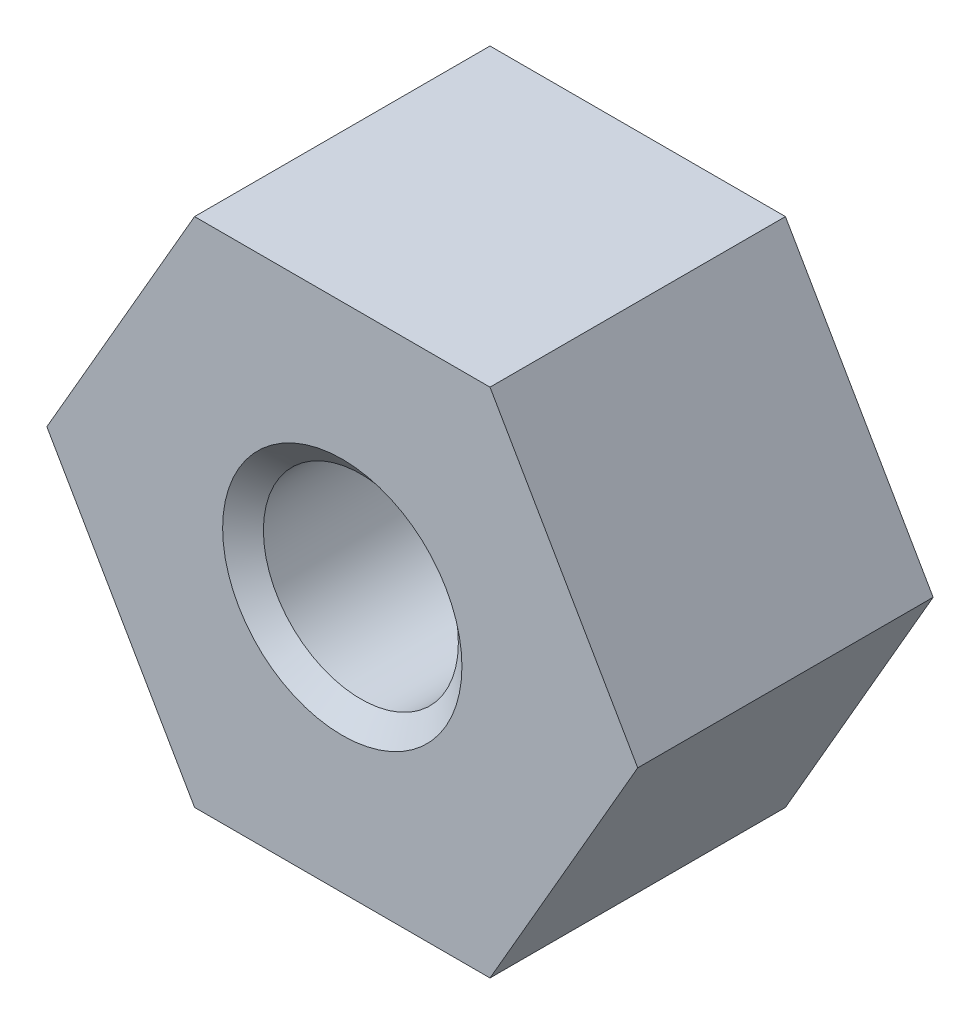
ISO-10303-21;
HEADER;
FILE_DESCRIPTION(('STEP AP214'),'2;1');
FILE_NAME('part.step','',(''),(''),'','','');
FILE_SCHEMA(('AUTOMOTIVE_DESIGN { 1 0 10303 214 1 1 1 1 }'));
ENDSEC;
DATA;
#1=APPLICATION_CONTEXT('core data for automotive mechanical design processes');
#2=APPLICATION_PROTOCOL_DEFINITION('international standard','automotive_design',2000,#1);
#3=PRODUCT_CONTEXT('',#1,'mechanical');
#4=PRODUCT('Part','Part','',(#3));
#5=PRODUCT_RELATED_PRODUCT_CATEGORY('part','',(#4));
#6=PRODUCT_DEFINITION_FORMATION('','',#4);
#7=PRODUCT_DEFINITION_CONTEXT('part definition',#1,'design');
#8=PRODUCT_DEFINITION('design','',#6,#7);
#9=PRODUCT_DEFINITION_SHAPE('','',#8);
#10=(LENGTH_UNIT() NAMED_UNIT(*) SI_UNIT(.MILLI.,.METRE.));
#11=(NAMED_UNIT(*) PLANE_ANGLE_UNIT() SI_UNIT($,.RADIAN.));
#12=(NAMED_UNIT(*) SI_UNIT($,.STERADIAN.) SOLID_ANGLE_UNIT());
#13=UNCERTAINTY_MEASURE_WITH_UNIT(LENGTH_MEASURE(1.E-05),#10,'distance_accuracy_value','');
#14=(GEOMETRIC_REPRESENTATION_CONTEXT(3) GLOBAL_UNCERTAINTY_ASSIGNED_CONTEXT((#13)) GLOBAL_UNIT_ASSIGNED_CONTEXT((#10,
#11,#12)) REPRESENTATION_CONTEXT('',''));
#15=CARTESIAN_POINT('',(0.,0.,0.));
#16=DIRECTION('',(0.,0.,1.));
#17=DIRECTION('',(1.,0.,0.));
#18=AXIS2_PLACEMENT_3D('',#15,#16,#17);
#19=CARTESIAN_POINT('',(2.5,-4.33012701892219,2.5));
#20=DIRECTION('',(-0.866025403784439,0.5,0.));
#21=DIRECTION('',(-0.5,-0.866025403784439,0.));
#22=AXIS2_PLACEMENT_3D('',#19,#20,#21);
#23=PLANE('',#22);
#24=DIRECTION('',(0.5,0.866025403784439,0.));
#25=VECTOR('',#24,1.);
#26=CARTESIAN_POINT('',(2.5,-4.33012701892219,-2.5));
#27=LINE('',#26,#25);
#28=CARTESIAN_POINT('',(2.5,-4.33012701892219,-2.5));
#29=VERTEX_POINT('',#28);
#30=CARTESIAN_POINT('',(5.,0.,-2.5));
#31=VERTEX_POINT('',#30);
#32=EDGE_CURVE('E130',#29,#31,#27,.T.);
#33=ORIENTED_EDGE('',*,*,#32,.T.);
#34=DIRECTION('',(0.,0.,-1.));
#35=VECTOR('',#34,1.);
#36=CARTESIAN_POINT('',(5.,0.,2.5));
#37=LINE('',#36,#35);
#38=CARTESIAN_POINT('',(5.,0.,2.5));
#39=VERTEX_POINT('',#38);
#40=EDGE_CURVE('E11',#39,#31,#37,.T.);
#41=ORIENTED_EDGE('',*,*,#40,.F.);
#42=DIRECTION('',(0.5,0.866025403784439,0.));
#43=VECTOR('',#42,1.);
#44=CARTESIAN_POINT('',(2.5,-4.33012701892219,2.5));
#45=LINE('',#44,#43);
#46=CARTESIAN_POINT('',(2.5,-4.33012701892219,2.5));
#47=VERTEX_POINT('',#46);
#48=EDGE_CURVE('E136',#47,#39,#45,.T.);
#49=ORIENTED_EDGE('',*,*,#48,.F.);
#50=DIRECTION('',(0.,0.,-1.));
#51=VECTOR('',#50,1.);
#52=CARTESIAN_POINT('',(2.5,-4.33012701892219,2.5));
#53=LINE('',#52,#51);
#54=EDGE_CURVE('E121',#47,#29,#53,.T.);
#55=ORIENTED_EDGE('',*,*,#54,.T.);
#56=EDGE_LOOP('',(#33,#41,#49,#55));
#57=FACE_BOUND('',#56,.T.);
#58=ADVANCED_FACE('F43',(#57),#23,.F.);
#59=CARTESIAN_POINT('',(5.,0.,2.5));
#60=DIRECTION('',(-0.866025403784438,-0.5,0.));
#61=DIRECTION('',(0.5,-0.866025403784439,0.));
#62=AXIS2_PLACEMENT_3D('',#59,#60,#61);
#63=PLANE('',#62);
#64=DIRECTION('',(-0.5,0.866025403784438,0.));
#65=VECTOR('',#64,1.);
#66=CARTESIAN_POINT('',(5.,0.,-2.5));
#67=LINE('',#66,#65);
#68=CARTESIAN_POINT('',(2.5,4.33012701892219,-2.5));
#69=VERTEX_POINT('',#68);
#70=EDGE_CURVE('E129',#31,#69,#67,.T.);
#71=ORIENTED_EDGE('',*,*,#70,.T.);
#72=DIRECTION('',(0.,0.,-1.));
#73=VECTOR('',#72,1.);
#74=CARTESIAN_POINT('',(2.5,4.33012701892219,2.5));
#75=LINE('',#74,#73);
#76=CARTESIAN_POINT('',(2.5,4.33012701892219,2.5));
#77=VERTEX_POINT('',#76);
#78=EDGE_CURVE('E51',#77,#69,#75,.T.);
#79=ORIENTED_EDGE('',*,*,#78,.F.);
#80=DIRECTION('',(-0.5,0.866025403784438,0.));
#81=VECTOR('',#80,1.);
#82=CARTESIAN_POINT('',(5.,0.,2.5));
#83=LINE('',#82,#81);
#84=EDGE_CURVE('E96',#39,#77,#83,.T.);
#85=ORIENTED_EDGE('',*,*,#84,.F.);
#86=ORIENTED_EDGE('',*,*,#40,.T.);
#87=EDGE_LOOP('',(#71,#79,#85,#86));
#88=FACE_BOUND('',#87,.T.);
#89=ADVANCED_FACE('F165',(#88),#63,.F.);
#90=CARTESIAN_POINT('',(2.5,4.33012701892219,2.5));
#91=DIRECTION('',(0.,-1.,0.));
#92=DIRECTION('',(1.,0.,0.));
#93=AXIS2_PLACEMENT_3D('',#90,#91,#92);
#94=PLANE('',#93);
#95=DIRECTION('',(-1.,0.,0.));
#96=VECTOR('',#95,1.);
#97=CARTESIAN_POINT('',(2.5,4.33012701892219,-2.5));
#98=LINE('',#97,#96);
#99=CARTESIAN_POINT('',(-2.5,4.33012701892219,-2.5));
#100=VERTEX_POINT('',#99);
#101=EDGE_CURVE('E131',#69,#100,#98,.T.);
#102=ORIENTED_EDGE('',*,*,#101,.T.);
#103=DIRECTION('',(0.,0.,-1.));
#104=VECTOR('',#103,1.);
#105=CARTESIAN_POINT('',(-2.5,4.33012701892219,2.5));
#106=LINE('',#105,#104);
#107=CARTESIAN_POINT('',(-2.5,4.33012701892219,2.5));
#108=VERTEX_POINT('',#107);
#109=EDGE_CURVE('E117',#108,#100,#106,.T.);
#110=ORIENTED_EDGE('',*,*,#109,.F.);
#111=DIRECTION('',(-1.,0.,0.));
#112=VECTOR('',#111,1.);
#113=CARTESIAN_POINT('',(2.5,4.33012701892219,2.5));
#114=LINE('',#113,#112);
#115=EDGE_CURVE('E106',#77,#108,#114,.T.);
#116=ORIENTED_EDGE('',*,*,#115,.F.);
#117=ORIENTED_EDGE('',*,*,#78,.T.);
#118=EDGE_LOOP('',(#102,#110,#116,#117));
#119=FACE_BOUND('',#118,.T.);
#120=ADVANCED_FACE('F142',(#119),#94,.F.);
#121=CARTESIAN_POINT('',(-2.5,4.33012701892219,2.5));
#122=DIRECTION('',(0.866025403784439,-0.5,0.));
#123=DIRECTION('',(0.5,0.866025403784439,0.));
#124=AXIS2_PLACEMENT_3D('',#121,#122,#123);
#125=PLANE('',#124);
#126=DIRECTION('',(-0.5,-0.866025403784439,0.));
#127=VECTOR('',#126,1.);
#128=CARTESIAN_POINT('',(-2.5,4.33012701892219,-2.5));
#129=LINE('',#128,#127);
#130=CARTESIAN_POINT('',(-5.,0.,-2.5));
#131=VERTEX_POINT('',#130);
#132=EDGE_CURVE('E119',#100,#131,#129,.T.);
#133=ORIENTED_EDGE('',*,*,#132,.T.);
#134=DIRECTION('',(0.,0.,-1.));
#135=VECTOR('',#134,1.);
#136=CARTESIAN_POINT('',(-5.,0.,2.5));
#137=LINE('',#136,#135);
#138=CARTESIAN_POINT('',(-5.,0.,2.5));
#139=VERTEX_POINT('',#138);
#140=EDGE_CURVE('E113',#139,#131,#137,.T.);
#141=ORIENTED_EDGE('',*,*,#140,.F.);
#142=DIRECTION('',(-0.5,-0.866025403784439,0.));
#143=VECTOR('',#142,1.);
#144=CARTESIAN_POINT('',(-2.5,4.33012701892219,2.5));
#145=LINE('',#144,#143);
#146=EDGE_CURVE('E102',#108,#139,#145,.T.);
#147=ORIENTED_EDGE('',*,*,#146,.F.);
#148=ORIENTED_EDGE('',*,*,#109,.T.);
#149=EDGE_LOOP('',(#133,#141,#147,#148));
#150=FACE_BOUND('',#149,.T.);
#151=ADVANCED_FACE('F112',(#150),#125,.F.);
#152=CARTESIAN_POINT('',(-5.,0.,2.5));
#153=DIRECTION('',(0.866025403784438,0.5,0.));
#154=DIRECTION('',(-0.5,0.866025403784439,0.));
#155=AXIS2_PLACEMENT_3D('',#152,#153,#154);
#156=PLANE('',#155);
#157=DIRECTION('',(0.5,-0.866025403784438,0.));
#158=VECTOR('',#157,1.);
#159=CARTESIAN_POINT('',(-5.,0.,-2.5));
#160=LINE('',#159,#158);
#161=CARTESIAN_POINT('',(-2.5,-4.33012701892219,-2.5));
#162=VERTEX_POINT('',#161);
#163=EDGE_CURVE('E82',#131,#162,#160,.T.);
#164=ORIENTED_EDGE('',*,*,#163,.T.);
#165=DIRECTION('',(0.,0.,-1.));
#166=VECTOR('',#165,1.);
#167=CARTESIAN_POINT('',(-2.5,-4.33012701892219,2.5));
#168=LINE('',#167,#166);
#169=CARTESIAN_POINT('',(-2.5,-4.33012701892219,2.5));
#170=VERTEX_POINT('',#169);
#171=EDGE_CURVE('E120',#170,#162,#168,.T.);
#172=ORIENTED_EDGE('',*,*,#171,.F.);
#173=DIRECTION('',(0.5,-0.866025403784438,0.));
#174=VECTOR('',#173,1.);
#175=CARTESIAN_POINT('',(-5.,0.,2.5));
#176=LINE('',#175,#174);
#177=EDGE_CURVE('E110',#139,#170,#176,.T.);
#178=ORIENTED_EDGE('',*,*,#177,.F.);
#179=ORIENTED_EDGE('',*,*,#140,.T.);
#180=EDGE_LOOP('',(#164,#172,#178,#179));
#181=FACE_BOUND('',#180,.T.);
#182=ADVANCED_FACE('F122',(#181),#156,.F.);
#183=CARTESIAN_POINT('',(-2.5,-4.33012701892219,2.5));
#184=DIRECTION('',(0.,1.,0.));
#185=DIRECTION('',(0.,0.,1.));
#186=AXIS2_PLACEMENT_3D('',#183,#184,#185);
#187=PLANE('',#186);
#188=DIRECTION('',(1.,0.,0.));
#189=VECTOR('',#188,1.);
#190=CARTESIAN_POINT('',(-2.5,-4.33012701892219,-2.5));
#191=LINE('',#190,#189);
#192=EDGE_CURVE('E86',#162,#29,#191,.T.);
#193=ORIENTED_EDGE('',*,*,#192,.T.);
#194=ORIENTED_EDGE('',*,*,#54,.F.);
#195=DIRECTION('',(1.,0.,0.));
#196=VECTOR('',#195,1.);
#197=CARTESIAN_POINT('',(-2.5,-4.33012701892219,2.5));
#198=LINE('',#197,#196);
#199=EDGE_CURVE('E56',#170,#47,#198,.T.);
#200=ORIENTED_EDGE('',*,*,#199,.F.);
#201=ORIENTED_EDGE('',*,*,#171,.T.);
#202=EDGE_LOOP('',(#193,#194,#200,#201));
#203=FACE_BOUND('',#202,.T.);
#204=ADVANCED_FACE('F151',(#203),#187,.F.);
#205=CARTESIAN_POINT('',(0.,0.,2.5));
#206=DIRECTION('',(0.,0.,1.));
#207=DIRECTION('',(1.,0.,0.));
#208=AXIS2_PLACEMENT_3D('',#205,#206,#207);
#209=PLANE('',#208);
#210=CARTESIAN_POINT('',(0.,0.,2.5));
#211=DIRECTION('',(0.,0.,1.));
#212=DIRECTION('',(1.,0.,0.));
#213=AXIS2_PLACEMENT_3D('',#210,#211,#212);
#214=CIRCLE('',#213,2.025);
#215=CARTESIAN_POINT('',(2.025,0.,2.5));
#216=VERTEX_POINT('',#215);
#217=EDGE_CURVE('E236',#216,#216,#214,.T.);
#218=ORIENTED_EDGE('',*,*,#217,.F.);
#219=EDGE_LOOP('',(#218));
#220=FACE_BOUND('',#219,.T.);
#221=ORIENTED_EDGE('',*,*,#48,.T.);
#222=ORIENTED_EDGE('',*,*,#84,.T.);
#223=ORIENTED_EDGE('',*,*,#115,.T.);
#224=ORIENTED_EDGE('',*,*,#146,.T.);
#225=ORIENTED_EDGE('',*,*,#177,.T.);
#226=ORIENTED_EDGE('',*,*,#199,.T.);
#227=EDGE_LOOP('',(#221,#222,#223,#224,#225,#226));
#228=FACE_BOUND('',#227,.T.);
#229=ADVANCED_FACE('F104',(#220,#228),#209,.T.);
#230=CARTESIAN_POINT('',(0.,0.,-2.5));
#231=DIRECTION('',(0.,0.,1.));
#232=DIRECTION('',(1.,0.,0.));
#233=AXIS2_PLACEMENT_3D('',#230,#231,#232);
#234=PLANE('',#233);
#235=CARTESIAN_POINT('',(0.,0.,-2.5));
#236=DIRECTION('',(0.,0.,1.));
#237=DIRECTION('',(1.,0.,0.));
#238=AXIS2_PLACEMENT_3D('',#235,#236,#237);
#239=CIRCLE('',#238,1.65);
#240=CARTESIAN_POINT('',(1.65,0.,-2.5));
#241=VERTEX_POINT('',#240);
#242=EDGE_CURVE('E133',#241,#241,#239,.T.);
#243=ORIENTED_EDGE('',*,*,#242,.T.);
#244=EDGE_LOOP('',(#243));
#245=FACE_BOUND('',#244,.T.);
#246=ORIENTED_EDGE('',*,*,#32,.F.);
#247=ORIENTED_EDGE('',*,*,#192,.F.);
#248=ORIENTED_EDGE('',*,*,#163,.F.);
#249=ORIENTED_EDGE('',*,*,#132,.F.);
#250=ORIENTED_EDGE('',*,*,#101,.F.);
#251=ORIENTED_EDGE('',*,*,#70,.F.);
#252=EDGE_LOOP('',(#246,#247,#248,#249,#250,#251));
#253=FACE_BOUND('',#252,.T.);
#254=ADVANCED_FACE('F150',(#245,#253),#234,.F.);
#255=CARTESIAN_POINT('',(0.,0.,2.5));
#256=DIRECTION('',(0.,0.,1.));
#257=DIRECTION('',(1.,0.,0.));
#258=AXIS2_PLACEMENT_3D('',#255,#256,#257);
#259=CYLINDRICAL_SURFACE('',#258,1.65);
#260=ORIENTED_EDGE('',*,*,#242,.F.);
#261=EDGE_LOOP('',(#260));
#262=FACE_BOUND('',#261,.T.);
#263=CARTESIAN_POINT('',(0.,0.,2.18533763830852));
#264=DIRECTION('',(0.,0.,1.));
#265=DIRECTION('',(1.,0.,0.));
#266=AXIS2_PLACEMENT_3D('',#263,#264,#265);
#267=CIRCLE('',#266,1.65);
#268=CARTESIAN_POINT('',(1.65,0.,2.18533763830852));
#269=VERTEX_POINT('',#268);
#270=EDGE_CURVE('E234',#269,#269,#267,.T.);
#271=ORIENTED_EDGE('',*,*,#270,.T.);
#272=EDGE_LOOP('',(#271));
#273=FACE_BOUND('',#272,.T.);
#274=ADVANCED_FACE('F205',(#262,#273),#259,.F.);
#275=CARTESIAN_POINT('',(0.,0.,2.5));
#276=DIRECTION('',(0.,0.,1.));
#277=DIRECTION('',(1.,0.,0.));
#278=AXIS2_PLACEMENT_3D('',#275,#276,#277);
#279=CONICAL_SURFACE('',#278,2.025,0.872664625997161);
#280=ORIENTED_EDGE('',*,*,#270,.F.);
#281=EDGE_LOOP('',(#280));
#282=FACE_BOUND('',#281,.T.);
#283=ORIENTED_EDGE('',*,*,#217,.T.);
#284=EDGE_LOOP('',(#283));
#285=FACE_BOUND('',#284,.T.);
#286=ADVANCED_FACE('F211',(#282,#285),#279,.F.);
#287=CLOSED_SHELL('',(#58,#89,#120,#151,#182,#204,#229,#254,#274,#286));
#288=MANIFOLD_SOLID_BREP('B2',#287);
#289=ADVANCED_BREP_SHAPE_REPRESENTATION('',(#18,#288),#14);
#290=SHAPE_DEFINITION_REPRESENTATION(#9,#289);
ENDSEC;
END-ISO-10303-21;
